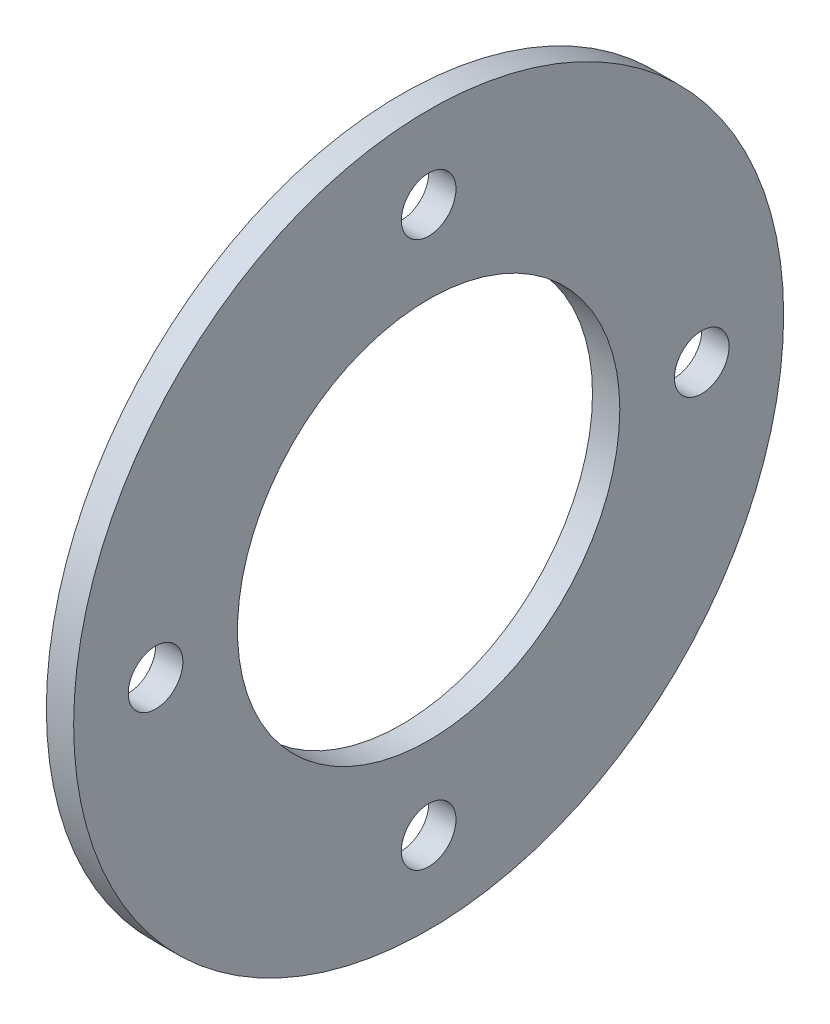
ISO-10303-21;
HEADER;
FILE_DESCRIPTION(('STEP AP214'),'2;1');
FILE_NAME('part.step','',(''),(''),'','','');
FILE_SCHEMA(('AUTOMOTIVE_DESIGN { 1 0 10303 214 1 1 1 1 }'));
ENDSEC;
DATA;
#1=APPLICATION_CONTEXT('core data for automotive mechanical design processes');
#2=APPLICATION_PROTOCOL_DEFINITION('international standard','automotive_design',2000,#1);
#3=PRODUCT_CONTEXT('',#1,'mechanical');
#4=PRODUCT('Part','Part','',(#3));
#5=PRODUCT_RELATED_PRODUCT_CATEGORY('part','',(#4));
#6=PRODUCT_DEFINITION_FORMATION('','',#4);
#7=PRODUCT_DEFINITION_CONTEXT('part definition',#1,'design');
#8=PRODUCT_DEFINITION('design','',#6,#7);
#9=PRODUCT_DEFINITION_SHAPE('','',#8);
#10=(LENGTH_UNIT() NAMED_UNIT(*) SI_UNIT(.MILLI.,.METRE.));
#11=(NAMED_UNIT(*) PLANE_ANGLE_UNIT() SI_UNIT($,.RADIAN.));
#12=(NAMED_UNIT(*) SI_UNIT($,.STERADIAN.) SOLID_ANGLE_UNIT());
#13=UNCERTAINTY_MEASURE_WITH_UNIT(LENGTH_MEASURE(1.E-05),#10,'distance_accuracy_value','');
#14=(GEOMETRIC_REPRESENTATION_CONTEXT(3) GLOBAL_UNCERTAINTY_ASSIGNED_CONTEXT((#13)) GLOBAL_UNIT_ASSIGNED_CONTEXT((#10,
#11,#12)) REPRESENTATION_CONTEXT('',''));
#15=CARTESIAN_POINT('',(0.,0.,0.));
#16=DIRECTION('',(0.,0.,1.));
#17=DIRECTION('',(1.,0.,0.));
#18=AXIS2_PLACEMENT_3D('',#15,#16,#17);
#19=CARTESIAN_POINT('',(2.,0.,0.));
#20=DIRECTION('',(1.,0.,0.));
#21=DIRECTION('',(0.,0.,-1.));
#22=AXIS2_PLACEMENT_3D('',#19,#20,#21);
#23=PLANE('',#22);
#24=CARTESIAN_POINT('',(2.,-20.,0.));
#25=DIRECTION('',(1.,0.,0.));
#26=DIRECTION('',(0.,0.,-1.));
#27=AXIS2_PLACEMENT_3D('',#24,#25,#26);
#28=CIRCLE('',#27,2.);
#29=CARTESIAN_POINT('',(2.,-20.,-2.));
#30=VERTEX_POINT('',#29);
#31=EDGE_CURVE('E67',#30,#30,#28,.T.);
#32=ORIENTED_EDGE('',*,*,#31,.F.);
#33=EDGE_LOOP('',(#32));
#34=FACE_BOUND('',#33,.T.);
#35=CARTESIAN_POINT('',(2.,20.,0.));
#36=DIRECTION('',(1.,0.,0.));
#37=DIRECTION('',(0.,0.,-1.));
#38=AXIS2_PLACEMENT_3D('',#35,#36,#37);
#39=CIRCLE('',#38,2.);
#40=CARTESIAN_POINT('',(2.,20.,-2.));
#41=VERTEX_POINT('',#40);
#42=EDGE_CURVE('E55',#41,#41,#39,.T.);
#43=ORIENTED_EDGE('',*,*,#42,.F.);
#44=EDGE_LOOP('',(#43));
#45=FACE_BOUND('',#44,.T.);
#46=CARTESIAN_POINT('',(2.,0.,0.));
#47=DIRECTION('',(1.,0.,0.));
#48=DIRECTION('',(0.,0.,-1.));
#49=AXIS2_PLACEMENT_3D('',#46,#47,#48);
#50=CIRCLE('',#49,26.);
#51=CARTESIAN_POINT('',(2.,0.,-26.));
#52=VERTEX_POINT('',#51);
#53=EDGE_CURVE('E10',#52,#52,#50,.T.);
#54=ORIENTED_EDGE('',*,*,#53,.T.);
#55=EDGE_LOOP('',(#54));
#56=FACE_BOUND('',#55,.T.);
#57=CARTESIAN_POINT('',(2.,0.,0.));
#58=DIRECTION('',(1.,0.,0.));
#59=DIRECTION('',(0.,0.,-1.));
#60=AXIS2_PLACEMENT_3D('',#57,#58,#59);
#61=CIRCLE('',#60,14.);
#62=CARTESIAN_POINT('',(2.,0.,-14.));
#63=VERTEX_POINT('',#62);
#64=EDGE_CURVE('E50',#63,#63,#61,.T.);
#65=ORIENTED_EDGE('',*,*,#64,.F.);
#66=EDGE_LOOP('',(#65));
#67=FACE_BOUND('',#66,.T.);
#68=CARTESIAN_POINT('',(2.,0.,-20.));
#69=DIRECTION('',(1.,0.,0.));
#70=DIRECTION('',(0.,0.,-1.));
#71=AXIS2_PLACEMENT_3D('',#68,#69,#70);
#72=CIRCLE('',#71,2.);
#73=CARTESIAN_POINT('',(2.,0.,-22.));
#74=VERTEX_POINT('',#73);
#75=EDGE_CURVE('E61',#74,#74,#72,.T.);
#76=ORIENTED_EDGE('',*,*,#75,.F.);
#77=EDGE_LOOP('',(#76));
#78=FACE_BOUND('',#77,.T.);
#79=CARTESIAN_POINT('',(2.,0.,20.));
#80=DIRECTION('',(1.,0.,0.));
#81=DIRECTION('',(0.,0.,-1.));
#82=AXIS2_PLACEMENT_3D('',#79,#80,#81);
#83=CIRCLE('',#82,2.);
#84=CARTESIAN_POINT('',(2.,0.,18.));
#85=VERTEX_POINT('',#84);
#86=EDGE_CURVE('E73',#85,#85,#83,.T.);
#87=ORIENTED_EDGE('',*,*,#86,.F.);
#88=EDGE_LOOP('',(#87));
#89=FACE_BOUND('',#88,.T.);
#90=ADVANCED_FACE('F39',(#34,#45,#56,#67,#78,#89),#23,.T.);
#91=CARTESIAN_POINT('',(0.,0.,0.));
#92=DIRECTION('',(1.,0.,0.));
#93=DIRECTION('',(0.,0.,-1.));
#94=AXIS2_PLACEMENT_3D('',#91,#92,#93);
#95=PLANE('',#94);
#96=CARTESIAN_POINT('',(0.,0.,0.));
#97=DIRECTION('',(1.,0.,0.));
#98=DIRECTION('',(0.,0.,-1.));
#99=AXIS2_PLACEMENT_3D('',#96,#97,#98);
#100=CIRCLE('',#99,26.);
#101=CARTESIAN_POINT('',(0.,0.,-26.));
#102=VERTEX_POINT('',#101);
#103=EDGE_CURVE('E43',#102,#102,#100,.T.);
#104=ORIENTED_EDGE('',*,*,#103,.F.);
#105=EDGE_LOOP('',(#104));
#106=FACE_BOUND('',#105,.T.);
#107=CARTESIAN_POINT('',(0.,0.,0.));
#108=DIRECTION('',(1.,0.,0.));
#109=DIRECTION('',(0.,0.,-1.));
#110=AXIS2_PLACEMENT_3D('',#107,#108,#109);
#111=CIRCLE('',#110,14.);
#112=CARTESIAN_POINT('',(0.,0.,-14.));
#113=VERTEX_POINT('',#112);
#114=EDGE_CURVE('E52',#113,#113,#111,.T.);
#115=ORIENTED_EDGE('',*,*,#114,.T.);
#116=EDGE_LOOP('',(#115));
#117=FACE_BOUND('',#116,.T.);
#118=CARTESIAN_POINT('',(0.,20.,0.));
#119=DIRECTION('',(1.,0.,0.));
#120=DIRECTION('',(0.,0.,-1.));
#121=AXIS2_PLACEMENT_3D('',#118,#119,#120);
#122=CIRCLE('',#121,2.);
#123=CARTESIAN_POINT('',(0.,20.,-2.));
#124=VERTEX_POINT('',#123);
#125=EDGE_CURVE('E58',#124,#124,#122,.T.);
#126=ORIENTED_EDGE('',*,*,#125,.T.);
#127=EDGE_LOOP('',(#126));
#128=FACE_BOUND('',#127,.T.);
#129=CARTESIAN_POINT('',(0.,0.,-20.));
#130=DIRECTION('',(1.,0.,0.));
#131=DIRECTION('',(0.,0.,-1.));
#132=AXIS2_PLACEMENT_3D('',#129,#130,#131);
#133=CIRCLE('',#132,2.);
#134=CARTESIAN_POINT('',(0.,0.,-22.));
#135=VERTEX_POINT('',#134);
#136=EDGE_CURVE('E64',#135,#135,#133,.T.);
#137=ORIENTED_EDGE('',*,*,#136,.T.);
#138=EDGE_LOOP('',(#137));
#139=FACE_BOUND('',#138,.T.);
#140=CARTESIAN_POINT('',(0.,-20.,0.));
#141=DIRECTION('',(1.,0.,0.));
#142=DIRECTION('',(0.,0.,-1.));
#143=AXIS2_PLACEMENT_3D('',#140,#141,#142);
#144=CIRCLE('',#143,2.);
#145=CARTESIAN_POINT('',(0.,-20.,-2.));
#146=VERTEX_POINT('',#145);
#147=EDGE_CURVE('E70',#146,#146,#144,.T.);
#148=ORIENTED_EDGE('',*,*,#147,.T.);
#149=EDGE_LOOP('',(#148));
#150=FACE_BOUND('',#149,.T.);
#151=CARTESIAN_POINT('',(0.,0.,20.));
#152=DIRECTION('',(1.,0.,0.));
#153=DIRECTION('',(0.,0.,-1.));
#154=AXIS2_PLACEMENT_3D('',#151,#152,#153);
#155=CIRCLE('',#154,2.);
#156=CARTESIAN_POINT('',(0.,0.,18.));
#157=VERTEX_POINT('',#156);
#158=EDGE_CURVE('E76',#157,#157,#155,.T.);
#159=ORIENTED_EDGE('',*,*,#158,.T.);
#160=EDGE_LOOP('',(#159));
#161=FACE_BOUND('',#160,.T.);
#162=ADVANCED_FACE('F86',(#106,#117,#128,#139,#150,#161),#95,.F.);
#163=CARTESIAN_POINT('',(2.,0.,0.));
#164=DIRECTION('',(-1.,0.,0.));
#165=DIRECTION('',(0.,0.,1.));
#166=AXIS2_PLACEMENT_3D('',#163,#164,#165);
#167=CYLINDRICAL_SURFACE('',#166,26.);
#168=ORIENTED_EDGE('',*,*,#53,.F.);
#169=EDGE_LOOP('',(#168));
#170=FACE_BOUND('',#169,.T.);
#171=ORIENTED_EDGE('',*,*,#103,.T.);
#172=EDGE_LOOP('',(#171));
#173=FACE_BOUND('',#172,.T.);
#174=ADVANCED_FACE('F41',(#170,#173),#167,.T.);
#175=CARTESIAN_POINT('',(2.,0.,0.));
#176=DIRECTION('',(-1.,0.,0.));
#177=DIRECTION('',(0.,0.,1.));
#178=AXIS2_PLACEMENT_3D('',#175,#176,#177);
#179=CYLINDRICAL_SURFACE('',#178,14.);
#180=ORIENTED_EDGE('',*,*,#64,.T.);
#181=EDGE_LOOP('',(#180));
#182=FACE_BOUND('',#181,.T.);
#183=ORIENTED_EDGE('',*,*,#114,.F.);
#184=EDGE_LOOP('',(#183));
#185=FACE_BOUND('',#184,.T.);
#186=ADVANCED_FACE('F96',(#182,#185),#179,.F.);
#187=CARTESIAN_POINT('',(2.,20.,0.));
#188=DIRECTION('',(-1.,0.,0.));
#189=DIRECTION('',(0.,0.,1.));
#190=AXIS2_PLACEMENT_3D('',#187,#188,#189);
#191=CYLINDRICAL_SURFACE('',#190,2.);
#192=ORIENTED_EDGE('',*,*,#42,.T.);
#193=EDGE_LOOP('',(#192));
#194=FACE_BOUND('',#193,.T.);
#195=ORIENTED_EDGE('',*,*,#125,.F.);
#196=EDGE_LOOP('',(#195));
#197=FACE_BOUND('',#196,.T.);
#198=ADVANCED_FACE('F99',(#194,#197),#191,.F.);
#199=CARTESIAN_POINT('',(2.,0.,-20.));
#200=DIRECTION('',(-1.,0.,0.));
#201=DIRECTION('',(0.,0.,1.));
#202=AXIS2_PLACEMENT_3D('',#199,#200,#201);
#203=CYLINDRICAL_SURFACE('',#202,2.);
#204=ORIENTED_EDGE('',*,*,#75,.T.);
#205=EDGE_LOOP('',(#204));
#206=FACE_BOUND('',#205,.T.);
#207=ORIENTED_EDGE('',*,*,#136,.F.);
#208=EDGE_LOOP('',(#207));
#209=FACE_BOUND('',#208,.T.);
#210=ADVANCED_FACE('F103',(#206,#209),#203,.F.);
#211=CARTESIAN_POINT('',(2.,-20.,0.));
#212=DIRECTION('',(-1.,0.,0.));
#213=DIRECTION('',(0.,0.,1.));
#214=AXIS2_PLACEMENT_3D('',#211,#212,#213);
#215=CYLINDRICAL_SURFACE('',#214,2.);
#216=ORIENTED_EDGE('',*,*,#31,.T.);
#217=EDGE_LOOP('',(#216));
#218=FACE_BOUND('',#217,.T.);
#219=ORIENTED_EDGE('',*,*,#147,.F.);
#220=EDGE_LOOP('',(#219));
#221=FACE_BOUND('',#220,.T.);
#222=ADVANCED_FACE('F107',(#218,#221),#215,.F.);
#223=CARTESIAN_POINT('',(2.,0.,20.));
#224=DIRECTION('',(-1.,0.,0.));
#225=DIRECTION('',(0.,0.,1.));
#226=AXIS2_PLACEMENT_3D('',#223,#224,#225);
#227=CYLINDRICAL_SURFACE('',#226,2.);
#228=ORIENTED_EDGE('',*,*,#86,.T.);
#229=EDGE_LOOP('',(#228));
#230=FACE_BOUND('',#229,.T.);
#231=ORIENTED_EDGE('',*,*,#158,.F.);
#232=EDGE_LOOP('',(#231));
#233=FACE_BOUND('',#232,.T.);
#234=ADVANCED_FACE('F82',(#230,#233),#227,.F.);
#235=CLOSED_SHELL('',(#90,#162,#174,#186,#198,#210,#222,#234));
#236=MANIFOLD_SOLID_BREP('B2',#235);
#237=ADVANCED_BREP_SHAPE_REPRESENTATION('',(#18,#236),#14);
#238=SHAPE_DEFINITION_REPRESENTATION(#9,#237);
ENDSEC;
END-ISO-10303-21;
